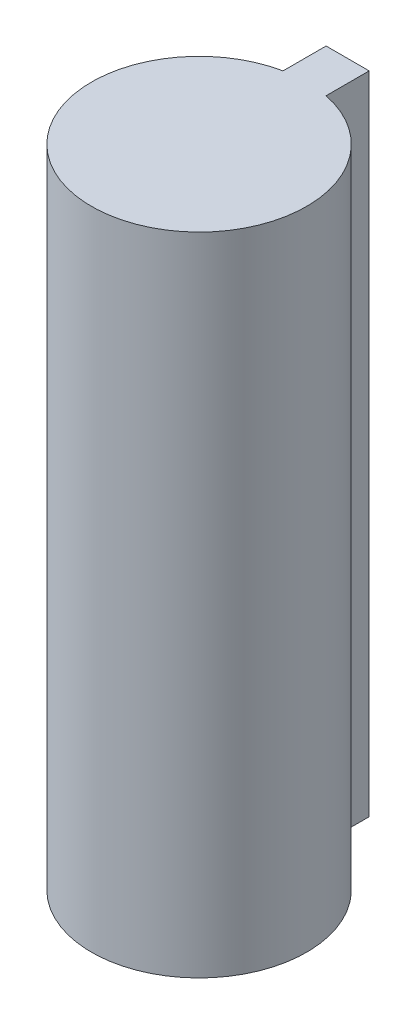
ISO-10303-21;
HEADER;
FILE_DESCRIPTION(('STEP AP214'),'2;1');
FILE_NAME('part.step','',(''),(''),'','','');
FILE_SCHEMA(('AUTOMOTIVE_DESIGN { 1 0 10303 214 1 1 1 1 }'));
ENDSEC;
DATA;
#1=APPLICATION_CONTEXT('core data for automotive mechanical design processes');
#2=APPLICATION_PROTOCOL_DEFINITION('international standard','automotive_design',2000,#1);
#3=PRODUCT_CONTEXT('',#1,'mechanical');
#4=PRODUCT('Part','Part','',(#3));
#5=PRODUCT_RELATED_PRODUCT_CATEGORY('part','',(#4));
#6=PRODUCT_DEFINITION_FORMATION('','',#4);
#7=PRODUCT_DEFINITION_CONTEXT('part definition',#1,'design');
#8=PRODUCT_DEFINITION('design','',#6,#7);
#9=PRODUCT_DEFINITION_SHAPE('','',#8);
#10=(LENGTH_UNIT() NAMED_UNIT(*) SI_UNIT(.MILLI.,.METRE.));
#11=(NAMED_UNIT(*) PLANE_ANGLE_UNIT() SI_UNIT($,.RADIAN.));
#12=(NAMED_UNIT(*) SI_UNIT($,.STERADIAN.) SOLID_ANGLE_UNIT());
#13=UNCERTAINTY_MEASURE_WITH_UNIT(LENGTH_MEASURE(1.E-05),#10,'distance_accuracy_value','');
#14=(GEOMETRIC_REPRESENTATION_CONTEXT(3) GLOBAL_UNCERTAINTY_ASSIGNED_CONTEXT((#13)) GLOBAL_UNIT_ASSIGNED_CONTEXT((#10,
#11,#12)) REPRESENTATION_CONTEXT('',''));
#15=CARTESIAN_POINT('',(0.,0.,0.));
#16=DIRECTION('',(0.,0.,1.));
#17=DIRECTION('',(1.,0.,0.));
#18=AXIS2_PLACEMENT_3D('',#15,#16,#17);
#19=CARTESIAN_POINT('',(0.,60.,0.));
#20=DIRECTION('',(0.,-1.,0.));
#21=DIRECTION('',(0.,0.,-1.));
#22=AXIS2_PLACEMENT_3D('',#19,#20,#21);
#23=CYLINDRICAL_SURFACE('',#22,10.);
#24=CARTESIAN_POINT('',(0.,0.,0.));
#25=DIRECTION('',(0.,1.,0.));
#26=DIRECTION('',(0.,0.,1.));
#27=AXIS2_PLACEMENT_3D('',#24,#25,#26);
#28=CIRCLE('',#27,10.);
#29=CARTESIAN_POINT('',(-2.,0.,-9.79795897113271));
#30=VERTEX_POINT('',#29);
#31=CARTESIAN_POINT('',(2.,0.,-9.79795897113271));
#32=VERTEX_POINT('',#31);
#33=EDGE_CURVE('E98',#30,#32,#28,.T.);
#34=ORIENTED_EDGE('',*,*,#33,.T.);
#35=DIRECTION('',(0.,-1.,0.));
#36=VECTOR('',#35,1.);
#37=CARTESIAN_POINT('',(2.,60.,-9.79795897113271));
#38=LINE('',#37,#36);
#39=CARTESIAN_POINT('',(2.,60.,-9.79795897113271));
#40=VERTEX_POINT('',#39);
#41=EDGE_CURVE('E11',#40,#32,#38,.T.);
#42=ORIENTED_EDGE('',*,*,#41,.F.);
#43=CARTESIAN_POINT('',(0.,60.,0.));
#44=DIRECTION('',(0.,1.,0.));
#45=DIRECTION('',(0.,0.,1.));
#46=AXIS2_PLACEMENT_3D('',#43,#44,#45);
#47=CIRCLE('',#46,10.);
#48=CARTESIAN_POINT('',(-2.,60.,-9.79795897113271));
#49=VERTEX_POINT('',#48);
#50=EDGE_CURVE('E86',#49,#40,#47,.T.);
#51=ORIENTED_EDGE('',*,*,#50,.F.);
#52=DIRECTION('',(0.,-1.,0.));
#53=VECTOR('',#52,1.);
#54=CARTESIAN_POINT('',(-2.,60.,-9.79795897113271));
#55=LINE('',#54,#53);
#56=EDGE_CURVE('E94',#49,#30,#55,.T.);
#57=ORIENTED_EDGE('',*,*,#56,.T.);
#58=EDGE_LOOP('',(#34,#42,#51,#57));
#59=FACE_BOUND('',#58,.T.);
#60=ADVANCED_FACE('F35',(#59),#23,.T.);
#61=CARTESIAN_POINT('',(2.,60.,-9.79795897113271));
#62=DIRECTION('',(-1.,0.,0.));
#63=DIRECTION('',(0.,0.,1.));
#64=AXIS2_PLACEMENT_3D('',#61,#62,#63);
#65=PLANE('',#64);
#66=DIRECTION('',(0.,0.,-1.));
#67=VECTOR('',#66,1.);
#68=CARTESIAN_POINT('',(2.,0.,-9.79795897113271));
#69=LINE('',#68,#67);
#70=CARTESIAN_POINT('',(2.,0.,-13.7979589711327));
#71=VERTEX_POINT('',#70);
#72=EDGE_CURVE('E90',#32,#71,#69,.T.);
#73=ORIENTED_EDGE('',*,*,#72,.T.);
#74=DIRECTION('',(0.,-1.,0.));
#75=VECTOR('',#74,1.);
#76=CARTESIAN_POINT('',(2.,60.,-13.7979589711327));
#77=LINE('',#76,#75);
#78=CARTESIAN_POINT('',(2.,60.,-13.7979589711327));
#79=VERTEX_POINT('',#78);
#80=EDGE_CURVE('E43',#79,#71,#77,.T.);
#81=ORIENTED_EDGE('',*,*,#80,.F.);
#82=DIRECTION('',(0.,0.,-1.));
#83=VECTOR('',#82,1.);
#84=CARTESIAN_POINT('',(2.,60.,-9.79795897113271));
#85=LINE('',#84,#83);
#86=EDGE_CURVE('E81',#40,#79,#85,.T.);
#87=ORIENTED_EDGE('',*,*,#86,.F.);
#88=ORIENTED_EDGE('',*,*,#41,.T.);
#89=EDGE_LOOP('',(#73,#81,#87,#88));
#90=FACE_BOUND('',#89,.T.);
#91=ADVANCED_FACE('F89',(#90),#65,.F.);
#92=CARTESIAN_POINT('',(-2.,60.,-13.7979589711327));
#93=DIRECTION('',(0.,0.,1.));
#94=DIRECTION('',(1.,0.,0.));
#95=AXIS2_PLACEMENT_3D('',#92,#93,#94);
#96=PLANE('',#95);
#97=DIRECTION('',(-1.,0.,0.));
#98=VECTOR('',#97,1.);
#99=CARTESIAN_POINT('',(-2.,0.,-13.7979589711327));
#100=LINE('',#99,#98);
#101=CARTESIAN_POINT('',(-2.,0.,-13.7979589711327));
#102=VERTEX_POINT('',#101);
#103=EDGE_CURVE('E68',#71,#102,#100,.T.);
#104=ORIENTED_EDGE('',*,*,#103,.T.);
#105=DIRECTION('',(0.,-1.,0.));
#106=VECTOR('',#105,1.);
#107=CARTESIAN_POINT('',(-2.,60.,-13.7979589711327));
#108=LINE('',#107,#106);
#109=CARTESIAN_POINT('',(-2.,60.,-13.7979589711327));
#110=VERTEX_POINT('',#109);
#111=EDGE_CURVE('E91',#110,#102,#108,.T.);
#112=ORIENTED_EDGE('',*,*,#111,.F.);
#113=DIRECTION('',(-1.,0.,0.));
#114=VECTOR('',#113,1.);
#115=CARTESIAN_POINT('',(-2.,60.,-13.7979589711327));
#116=LINE('',#115,#114);
#117=EDGE_CURVE('E84',#79,#110,#116,.T.);
#118=ORIENTED_EDGE('',*,*,#117,.F.);
#119=ORIENTED_EDGE('',*,*,#80,.T.);
#120=EDGE_LOOP('',(#104,#112,#118,#119));
#121=FACE_BOUND('',#120,.T.);
#122=ADVANCED_FACE('F92',(#121),#96,.F.);
#123=CARTESIAN_POINT('',(-2.,60.,-9.79795897113271));
#124=DIRECTION('',(1.,0.,0.));
#125=DIRECTION('',(0.,0.,-1.));
#126=AXIS2_PLACEMENT_3D('',#123,#124,#125);
#127=PLANE('',#126);
#128=DIRECTION('',(0.,0.,1.));
#129=VECTOR('',#128,1.);
#130=CARTESIAN_POINT('',(-2.,0.,-9.79795897113271));
#131=LINE('',#130,#129);
#132=EDGE_CURVE('E74',#102,#30,#131,.T.);
#133=ORIENTED_EDGE('',*,*,#132,.T.);
#134=ORIENTED_EDGE('',*,*,#56,.F.);
#135=DIRECTION('',(0.,0.,1.));
#136=VECTOR('',#135,1.);
#137=CARTESIAN_POINT('',(-2.,60.,-9.79795897113271));
#138=LINE('',#137,#136);
#139=EDGE_CURVE('E51',#110,#49,#138,.T.);
#140=ORIENTED_EDGE('',*,*,#139,.F.);
#141=ORIENTED_EDGE('',*,*,#111,.T.);
#142=EDGE_LOOP('',(#133,#134,#140,#141));
#143=FACE_BOUND('',#142,.T.);
#144=ADVANCED_FACE('F105',(#143),#127,.F.);
#145=CARTESIAN_POINT('',(0.,60.,0.));
#146=DIRECTION('',(0.,1.,0.));
#147=DIRECTION('',(0.,0.,1.));
#148=AXIS2_PLACEMENT_3D('',#145,#146,#147);
#149=PLANE('',#148);
#150=ORIENTED_EDGE('',*,*,#50,.T.);
#151=ORIENTED_EDGE('',*,*,#86,.T.);
#152=ORIENTED_EDGE('',*,*,#117,.T.);
#153=ORIENTED_EDGE('',*,*,#139,.T.);
#154=EDGE_LOOP('',(#150,#151,#152,#153));
#155=FACE_BOUND('',#154,.T.);
#156=ADVANCED_FACE('F82',(#155),#149,.T.);
#157=CARTESIAN_POINT('',(0.,0.,0.));
#158=DIRECTION('',(0.,1.,0.));
#159=DIRECTION('',(0.,0.,1.));
#160=AXIS2_PLACEMENT_3D('',#157,#158,#159);
#161=PLANE('',#160);
#162=ORIENTED_EDGE('',*,*,#33,.F.);
#163=ORIENTED_EDGE('',*,*,#132,.F.);
#164=ORIENTED_EDGE('',*,*,#103,.F.);
#165=ORIENTED_EDGE('',*,*,#72,.F.);
#166=EDGE_LOOP('',(#162,#163,#164,#165));
#167=FACE_BOUND('',#166,.T.);
#168=ADVANCED_FACE('F108',(#167),#161,.F.);
#169=CLOSED_SHELL('',(#60,#91,#122,#144,#156,#168));
#170=MANIFOLD_SOLID_BREP('B2',#169);
#171=ADVANCED_BREP_SHAPE_REPRESENTATION('',(#18,#170),#14);
#172=SHAPE_DEFINITION_REPRESENTATION(#9,#171);
ENDSEC;
END-ISO-10303-21;
